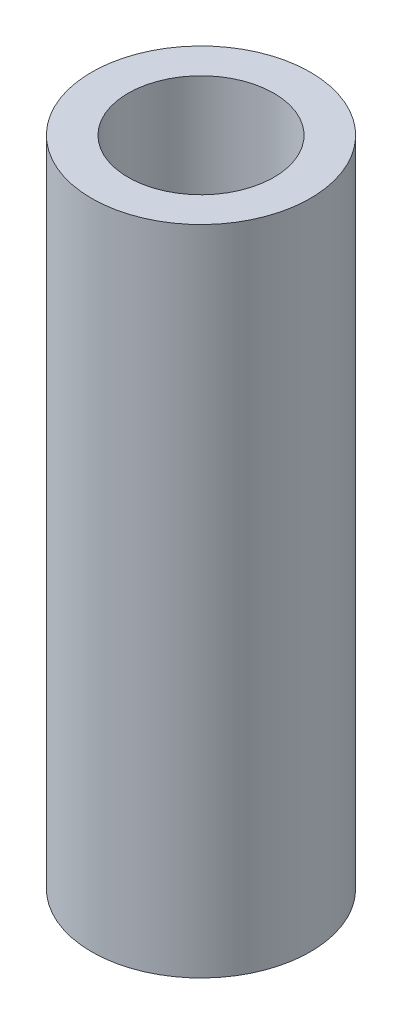
ISO-10303-21;
HEADER;
FILE_DESCRIPTION(('STEP AP214'),'2;1');
FILE_NAME('part.step','',(''),(''),'','','');
FILE_SCHEMA(('AUTOMOTIVE_DESIGN { 1 0 10303 214 1 1 1 1 }'));
ENDSEC;
DATA;
#1=APPLICATION_CONTEXT('core data for automotive mechanical design processes');
#2=APPLICATION_PROTOCOL_DEFINITION('international standard','automotive_design',2000,#1);
#3=PRODUCT_CONTEXT('',#1,'mechanical');
#4=PRODUCT('Part','Part','',(#3));
#5=PRODUCT_RELATED_PRODUCT_CATEGORY('part','',(#4));
#6=PRODUCT_DEFINITION_FORMATION('','',#4);
#7=PRODUCT_DEFINITION_CONTEXT('part definition',#1,'design');
#8=PRODUCT_DEFINITION('design','',#6,#7);
#9=PRODUCT_DEFINITION_SHAPE('','',#8);
#10=(LENGTH_UNIT() NAMED_UNIT(*) SI_UNIT(.MILLI.,.METRE.));
#11=(NAMED_UNIT(*) PLANE_ANGLE_UNIT() SI_UNIT($,.RADIAN.));
#12=(NAMED_UNIT(*) SI_UNIT($,.STERADIAN.) SOLID_ANGLE_UNIT());
#13=UNCERTAINTY_MEASURE_WITH_UNIT(LENGTH_MEASURE(1.E-05),#10,'distance_accuracy_value','');
#14=(GEOMETRIC_REPRESENTATION_CONTEXT(3) GLOBAL_UNCERTAINTY_ASSIGNED_CONTEXT((#13)) GLOBAL_UNIT_ASSIGNED_CONTEXT((#10,
#11,#12)) REPRESENTATION_CONTEXT('',''));
#15=CARTESIAN_POINT('',(0.,0.,0.));
#16=DIRECTION('',(0.,0.,1.));
#17=DIRECTION('',(1.,0.,0.));
#18=AXIS2_PLACEMENT_3D('',#15,#16,#17);
#19=CARTESIAN_POINT('',(0.,17.9,0.));
#20=DIRECTION('',(0.,1.,0.));
#21=DIRECTION('',(0.,0.,1.));
#22=AXIS2_PLACEMENT_3D('',#19,#20,#21);
#23=PLANE('',#22);
#24=CARTESIAN_POINT('',(0.,17.9,0.));
#25=DIRECTION('',(0.,1.,0.));
#26=DIRECTION('',(0.,0.,1.));
#27=AXIS2_PLACEMENT_3D('',#24,#25,#26);
#28=CIRCLE('',#27,3.);
#29=CARTESIAN_POINT('',(0.,17.9,-3.));
#30=VERTEX_POINT('',#29);
#31=EDGE_CURVE('E10',#30,#30,#28,.T.);
#32=ORIENTED_EDGE('',*,*,#31,.T.);
#33=EDGE_LOOP('',(#32));
#34=FACE_BOUND('',#33,.T.);
#35=CARTESIAN_POINT('',(0.,17.9,0.));
#36=DIRECTION('',(0.,1.,0.));
#37=DIRECTION('',(0.,0.,1.));
#38=AXIS2_PLACEMENT_3D('',#35,#36,#37);
#39=CIRCLE('',#38,2.);
#40=CARTESIAN_POINT('',(0.,17.9,-2.));
#41=VERTEX_POINT('',#40);
#42=EDGE_CURVE('E42',#41,#41,#39,.T.);
#43=ORIENTED_EDGE('',*,*,#42,.F.);
#44=EDGE_LOOP('',(#43));
#45=FACE_BOUND('',#44,.T.);
#46=ADVANCED_FACE('F31',(#34,#45),#23,.T.);
#47=CARTESIAN_POINT('',(0.,0.,0.));
#48=DIRECTION('',(0.,1.,0.));
#49=DIRECTION('',(0.,0.,1.));
#50=AXIS2_PLACEMENT_3D('',#47,#48,#49);
#51=PLANE('',#50);
#52=CARTESIAN_POINT('',(0.,0.,0.));
#53=DIRECTION('',(0.,1.,0.));
#54=DIRECTION('',(0.,0.,1.));
#55=AXIS2_PLACEMENT_3D('',#52,#53,#54);
#56=CIRCLE('',#55,3.);
#57=CARTESIAN_POINT('',(0.,0.,-3.));
#58=VERTEX_POINT('',#57);
#59=EDGE_CURVE('E35',#58,#58,#56,.T.);
#60=ORIENTED_EDGE('',*,*,#59,.F.);
#61=EDGE_LOOP('',(#60));
#62=FACE_BOUND('',#61,.T.);
#63=CARTESIAN_POINT('',(0.,0.,0.));
#64=DIRECTION('',(0.,1.,0.));
#65=DIRECTION('',(0.,0.,1.));
#66=AXIS2_PLACEMENT_3D('',#63,#64,#65);
#67=CIRCLE('',#66,2.);
#68=CARTESIAN_POINT('',(0.,0.,-2.));
#69=VERTEX_POINT('',#68);
#70=EDGE_CURVE('E44',#69,#69,#67,.T.);
#71=ORIENTED_EDGE('',*,*,#70,.T.);
#72=EDGE_LOOP('',(#71));
#73=FACE_BOUND('',#72,.T.);
#74=ADVANCED_FACE('F54',(#62,#73),#51,.F.);
#75=CARTESIAN_POINT('',(0.,17.9,0.));
#76=DIRECTION('',(0.,-1.,0.));
#77=DIRECTION('',(0.,0.,-1.));
#78=AXIS2_PLACEMENT_3D('',#75,#76,#77);
#79=CYLINDRICAL_SURFACE('',#78,3.);
#80=CARTESIAN_POINT('',(0.,17.9,-3.));
#81=CARTESIAN_POINT('',(0.,17.7135416666667,-3.));
#82=CARTESIAN_POINT('',(0.,17.5270833333333,-3.));
#83=CARTESIAN_POINT('',(0.,17.1541666666667,-3.));
#84=CARTESIAN_POINT('',(0.,16.9677083333333,-3.));
#85=CARTESIAN_POINT('',(0.,16.5947916666667,-3.));
#86=CARTESIAN_POINT('',(0.,16.4083333333333,-3.));
#87=CARTESIAN_POINT('',(0.,16.0354166666667,-3.));
#88=CARTESIAN_POINT('',(0.,15.8489583333333,-3.));
#89=CARTESIAN_POINT('',(0.,15.4760416666667,-3.));
#90=CARTESIAN_POINT('',(0.,15.2895833333333,-3.));
#91=CARTESIAN_POINT('',(0.,14.9166666666667,-3.));
#92=CARTESIAN_POINT('',(0.,14.7302083333333,-3.));
#93=CARTESIAN_POINT('',(0.,14.3572916666667,-3.));
#94=CARTESIAN_POINT('',(0.,14.1708333333333,-3.));
#95=CARTESIAN_POINT('',(0.,13.7979166666667,-3.));
#96=CARTESIAN_POINT('',(0.,13.6114583333333,-3.));
#97=CARTESIAN_POINT('',(0.,13.2385416666667,-3.));
#98=CARTESIAN_POINT('',(0.,13.0520833333333,-3.));
#99=CARTESIAN_POINT('',(0.,12.6791666666667,-3.));
#100=CARTESIAN_POINT('',(0.,12.4927083333333,-3.));
#101=CARTESIAN_POINT('',(0.,12.1197916666667,-3.));
#102=CARTESIAN_POINT('',(0.,11.9333333333333,-3.));
#103=CARTESIAN_POINT('',(0.,11.5604166666667,-3.));
#104=CARTESIAN_POINT('',(0.,11.3739583333333,-3.));
#105=CARTESIAN_POINT('',(0.,11.0010416666667,-3.));
#106=CARTESIAN_POINT('',(0.,10.8145833333333,-3.));
#107=CARTESIAN_POINT('',(0.,10.4416666666667,-3.));
#108=CARTESIAN_POINT('',(0.,10.2552083333333,-3.));
#109=CARTESIAN_POINT('',(0.,9.88229166666666,-3.));
#110=CARTESIAN_POINT('',(0.,9.69583333333333,-3.));
#111=CARTESIAN_POINT('',(0.,9.32291666666666,-3.));
#112=CARTESIAN_POINT('',(0.,9.13645833333333,-3.));
#113=CARTESIAN_POINT('',(0.,8.76354166666666,-3.));
#114=CARTESIAN_POINT('',(0.,8.57708333333333,-3.));
#115=CARTESIAN_POINT('',(0.,8.20416666666666,-3.));
#116=CARTESIAN_POINT('',(0.,8.01770833333333,-3.));
#117=CARTESIAN_POINT('',(0.,7.64479166666666,-3.));
#118=CARTESIAN_POINT('',(0.,7.45833333333333,-3.));
#119=CARTESIAN_POINT('',(0.,7.08541666666666,-3.));
#120=CARTESIAN_POINT('',(0.,6.89895833333333,-3.));
#121=CARTESIAN_POINT('',(0.,6.52604166666666,-3.));
#122=CARTESIAN_POINT('',(0.,6.33958333333333,-3.));
#123=CARTESIAN_POINT('',(0.,5.96666666666666,-3.));
#124=CARTESIAN_POINT('',(0.,5.78020833333333,-3.));
#125=CARTESIAN_POINT('',(0.,5.40729166666666,-3.));
#126=CARTESIAN_POINT('',(0.,5.22083333333333,-3.));
#127=CARTESIAN_POINT('',(0.,4.84791666666666,-3.));
#128=CARTESIAN_POINT('',(0.,4.66145833333333,-3.));
#129=CARTESIAN_POINT('',(0.,4.28854166666666,-3.));
#130=CARTESIAN_POINT('',(0.,4.10208333333333,-3.));
#131=CARTESIAN_POINT('',(0.,3.72916666666666,-3.));
#132=CARTESIAN_POINT('',(0.,3.54270833333333,-3.));
#133=CARTESIAN_POINT('',(0.,3.16979166666666,-3.));
#134=CARTESIAN_POINT('',(0.,2.98333333333333,-3.));
#135=CARTESIAN_POINT('',(0.,2.61041666666666,-3.));
#136=CARTESIAN_POINT('',(0.,2.42395833333333,-3.));
#137=CARTESIAN_POINT('',(0.,2.05104166666666,-3.));
#138=CARTESIAN_POINT('',(0.,1.86458333333333,-3.));
#139=CARTESIAN_POINT('',(0.,1.49166666666666,-3.));
#140=CARTESIAN_POINT('',(0.,1.30520833333333,-3.));
#141=CARTESIAN_POINT('',(0.,0.932291666666665,-3.));
#142=CARTESIAN_POINT('',(0.,0.745833333333331,-3.));
#143=CARTESIAN_POINT('',(0.,0.372916666666664,-3.));
#144=CARTESIAN_POINT('',(0.,0.18645833333333,-3.));
#145=CARTESIAN_POINT('',(0.,0.,-3.));
#146=B_SPLINE_CURVE_WITH_KNOTS('',3,(#80,#81,#82,#83,#84,#85,#86,#87,#88,#89,#90,#91,#92,#93,
#94,#95,#96,#97,#98,#99,#100,#101,#102,#103,#104,#105,#106,#107,#108,#109,#110,#111,#112,#113,
#114,#115,#116,#117,#118,#119,#120,#121,#122,#123,#124,#125,#126,#127,#128,#129,#130,#131,#132,
#133,#134,#135,#136,#137,#138,#139,#140,#141,#142,#143,#144,#145),.UNSPECIFIED.,.F.,.F.,(4,2,2,
2,2,2,2,2,2,2,2,2,2,2,2,2,2,2,2,2,2,2,2,2,2,2,2,2,2,2,2,2,4),(0.,0.559375000000001,1.11875,
1.678125,2.2375,2.796875,3.35625,3.915625,4.475,5.034375,5.59375,6.153125,6.7125,7.271875,
7.83125,8.390625,8.95,9.509375,10.06875,10.628125,11.1875,11.746875,12.30625,12.865625,13.425,
13.984375,14.54375,15.103125,15.6625,16.221875,16.78125,17.340625,17.9),.UNSPECIFIED.);
#147=EDGE_CURVE('BSEAM33',#30,#58,#146,.T.);
#148=ORIENTED_EDGE('',*,*,#31,.F.);
#149=ORIENTED_EDGE('',*,*,#59,.T.);
#150=ORIENTED_EDGE('',*,*,#147,.T.);
#151=ORIENTED_EDGE('',*,*,#147,.F.);
#152=EDGE_LOOP('',(#148,#150,#149,#151));
#153=FACE_BOUND('',#152,.T.);
#154=ADVANCED_FACE('F33',(#153),#79,.T.);
#155=CARTESIAN_POINT('',(0.,17.9,0.));
#156=DIRECTION('',(0.,-1.,0.));
#157=DIRECTION('',(0.,0.,-1.));
#158=AXIS2_PLACEMENT_3D('',#155,#156,#157);
#159=CYLINDRICAL_SURFACE('',#158,2.);
#160=CARTESIAN_POINT('',(0.,17.9,-2.));
#161=CARTESIAN_POINT('',(0.,17.7135416666667,-2.));
#162=CARTESIAN_POINT('',(0.,17.5270833333333,-2.));
#163=CARTESIAN_POINT('',(0.,17.1541666666667,-2.));
#164=CARTESIAN_POINT('',(0.,16.9677083333333,-2.));
#165=CARTESIAN_POINT('',(0.,16.5947916666667,-2.));
#166=CARTESIAN_POINT('',(0.,16.4083333333333,-2.));
#167=CARTESIAN_POINT('',(0.,16.0354166666667,-2.));
#168=CARTESIAN_POINT('',(0.,15.8489583333333,-2.));
#169=CARTESIAN_POINT('',(0.,15.4760416666667,-2.));
#170=CARTESIAN_POINT('',(0.,15.2895833333333,-2.));
#171=CARTESIAN_POINT('',(0.,14.9166666666667,-2.));
#172=CARTESIAN_POINT('',(0.,14.7302083333333,-2.));
#173=CARTESIAN_POINT('',(0.,14.3572916666667,-2.));
#174=CARTESIAN_POINT('',(0.,14.1708333333333,-2.));
#175=CARTESIAN_POINT('',(0.,13.7979166666667,-2.));
#176=CARTESIAN_POINT('',(0.,13.6114583333333,-2.));
#177=CARTESIAN_POINT('',(0.,13.2385416666667,-2.));
#178=CARTESIAN_POINT('',(0.,13.0520833333333,-2.));
#179=CARTESIAN_POINT('',(0.,12.6791666666667,-2.));
#180=CARTESIAN_POINT('',(0.,12.4927083333333,-2.));
#181=CARTESIAN_POINT('',(0.,12.1197916666667,-2.));
#182=CARTESIAN_POINT('',(0.,11.9333333333333,-2.));
#183=CARTESIAN_POINT('',(0.,11.5604166666667,-2.));
#184=CARTESIAN_POINT('',(0.,11.3739583333333,-2.));
#185=CARTESIAN_POINT('',(0.,11.0010416666667,-2.));
#186=CARTESIAN_POINT('',(0.,10.8145833333333,-2.));
#187=CARTESIAN_POINT('',(0.,10.4416666666667,-2.));
#188=CARTESIAN_POINT('',(0.,10.2552083333333,-2.));
#189=CARTESIAN_POINT('',(0.,9.88229166666666,-2.));
#190=CARTESIAN_POINT('',(0.,9.69583333333333,-2.));
#191=CARTESIAN_POINT('',(0.,9.32291666666666,-2.));
#192=CARTESIAN_POINT('',(0.,9.13645833333333,-2.));
#193=CARTESIAN_POINT('',(0.,8.76354166666667,-2.));
#194=CARTESIAN_POINT('',(0.,8.57708333333333,-2.));
#195=CARTESIAN_POINT('',(0.,8.20416666666666,-2.));
#196=CARTESIAN_POINT('',(0.,8.01770833333333,-2.));
#197=CARTESIAN_POINT('',(0.,7.64479166666666,-2.));
#198=CARTESIAN_POINT('',(0.,7.45833333333333,-2.));
#199=CARTESIAN_POINT('',(0.,7.08541666666666,-2.));
#200=CARTESIAN_POINT('',(0.,6.89895833333333,-2.));
#201=CARTESIAN_POINT('',(0.,6.52604166666666,-2.));
#202=CARTESIAN_POINT('',(0.,6.33958333333333,-2.));
#203=CARTESIAN_POINT('',(0.,5.96666666666666,-2.));
#204=CARTESIAN_POINT('',(0.,5.78020833333333,-2.));
#205=CARTESIAN_POINT('',(0.,5.40729166666666,-2.));
#206=CARTESIAN_POINT('',(0.,5.22083333333333,-2.));
#207=CARTESIAN_POINT('',(0.,4.84791666666666,-2.));
#208=CARTESIAN_POINT('',(0.,4.66145833333333,-2.));
#209=CARTESIAN_POINT('',(0.,4.28854166666666,-2.));
#210=CARTESIAN_POINT('',(0.,4.10208333333333,-2.));
#211=CARTESIAN_POINT('',(0.,3.72916666666666,-2.));
#212=CARTESIAN_POINT('',(0.,3.54270833333333,-2.));
#213=CARTESIAN_POINT('',(0.,3.16979166666666,-2.));
#214=CARTESIAN_POINT('',(0.,2.98333333333333,-2.));
#215=CARTESIAN_POINT('',(0.,2.61041666666666,-2.));
#216=CARTESIAN_POINT('',(0.,2.42395833333333,-2.));
#217=CARTESIAN_POINT('',(0.,2.05104166666666,-2.));
#218=CARTESIAN_POINT('',(0.,1.86458333333333,-2.));
#219=CARTESIAN_POINT('',(0.,1.49166666666666,-2.));
#220=CARTESIAN_POINT('',(0.,1.30520833333333,-2.));
#221=CARTESIAN_POINT('',(0.,0.932291666666665,-2.));
#222=CARTESIAN_POINT('',(0.,0.745833333333331,-2.));
#223=CARTESIAN_POINT('',(0.,0.372916666666664,-2.));
#224=CARTESIAN_POINT('',(0.,0.18645833333333,-2.));
#225=CARTESIAN_POINT('',(0.,0.,-2.));
#226=B_SPLINE_CURVE_WITH_KNOTS('',3,(#160,#161,#162,#163,#164,#165,#166,#167,#168,#169,#170,
#171,#172,#173,#174,#175,#176,#177,#178,#179,#180,#181,#182,#183,#184,#185,#186,#187,#188,#189,
#190,#191,#192,#193,#194,#195,#196,#197,#198,#199,#200,#201,#202,#203,#204,#205,#206,#207,#208,
#209,#210,#211,#212,#213,#214,#215,#216,#217,#218,#219,#220,#221,#222,#223,#224,#225),
.UNSPECIFIED.,.F.,.F.,(4,2,2,2,2,2,2,2,2,2,2,2,2,2,2,2,2,2,2,2,2,2,2,2,2,2,2,2,2,2,2,2,4),(0.,
0.559374999999997,1.11875,1.678125,2.2375,2.796875,3.35625,3.915625,4.475,5.034375,5.59375,
6.153125,6.7125,7.271875,7.83125,8.390625,8.95,9.509375,10.06875,10.628125,11.1875,11.746875,
12.30625,12.865625,13.425,13.984375,14.54375,15.103125,15.6625,16.221875,16.78125,17.340625,
17.9),.UNSPECIFIED.);
#227=EDGE_CURVE('BSEAM50',#41,#69,#226,.T.);
#228=ORIENTED_EDGE('',*,*,#42,.T.);
#229=ORIENTED_EDGE('',*,*,#70,.F.);
#230=ORIENTED_EDGE('',*,*,#227,.T.);
#231=ORIENTED_EDGE('',*,*,#227,.F.);
#232=EDGE_LOOP('',(#228,#230,#229,#231));
#233=FACE_BOUND('',#232,.T.);
#234=ADVANCED_FACE('F50',(#233),#159,.F.);
#235=CLOSED_SHELL('',(#46,#74,#154,#234));
#236=MANIFOLD_SOLID_BREP('B2',#235);
#237=ADVANCED_BREP_SHAPE_REPRESENTATION('',(#18,#236),#14);
#238=SHAPE_DEFINITION_REPRESENTATION(#9,#237);
ENDSEC;
END-ISO-10303-21;
